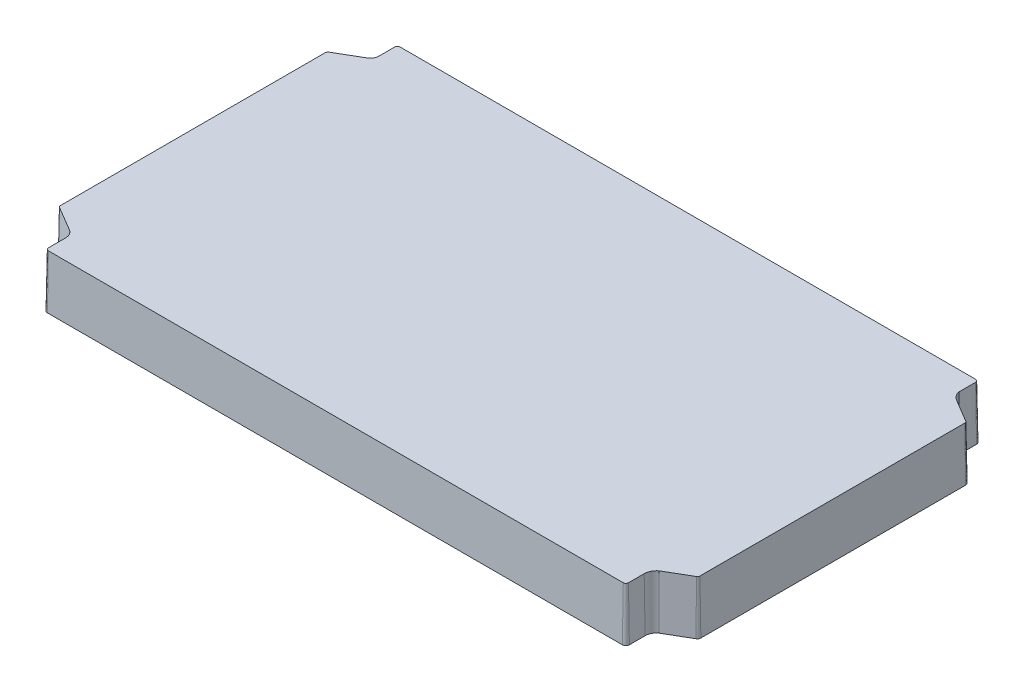
ISO-10303-21;
HEADER;
FILE_DESCRIPTION(('STEP AP214'),'2;1');
FILE_NAME('part.step','',(''),(''),'','','');
FILE_SCHEMA(('AUTOMOTIVE_DESIGN { 1 0 10303 214 1 1 1 1 }'));
ENDSEC;
DATA;
#1=APPLICATION_CONTEXT('core data for automotive mechanical design processes');
#2=APPLICATION_PROTOCOL_DEFINITION('international standard','automotive_design',2000,#1);
#3=PRODUCT_CONTEXT('',#1,'mechanical');
#4=PRODUCT('Part','Part','',(#3));
#5=PRODUCT_RELATED_PRODUCT_CATEGORY('part','',(#4));
#6=PRODUCT_DEFINITION_FORMATION('','',#4);
#7=PRODUCT_DEFINITION_CONTEXT('part definition',#1,'design');
#8=PRODUCT_DEFINITION('design','',#6,#7);
#9=PRODUCT_DEFINITION_SHAPE('','',#8);
#10=(LENGTH_UNIT() NAMED_UNIT(*) SI_UNIT(.MILLI.,.METRE.));
#11=(NAMED_UNIT(*) PLANE_ANGLE_UNIT() SI_UNIT($,.RADIAN.));
#12=(NAMED_UNIT(*) SI_UNIT($,.STERADIAN.) SOLID_ANGLE_UNIT());
#13=UNCERTAINTY_MEASURE_WITH_UNIT(LENGTH_MEASURE(1.E-05),#10,'distance_accuracy_value','');
#14=(GEOMETRIC_REPRESENTATION_CONTEXT(3) GLOBAL_UNCERTAINTY_ASSIGNED_CONTEXT((#13)) GLOBAL_UNIT_ASSIGNED_CONTEXT((#10,
#11,#12)) REPRESENTATION_CONTEXT('',''));
#15=CARTESIAN_POINT('',(0.,0.,0.));
#16=DIRECTION('',(0.,0.,1.));
#17=DIRECTION('',(1.,0.,0.));
#18=AXIS2_PLACEMENT_3D('',#15,#16,#17);
#19=CARTESIAN_POINT('',(1.27525855985953,-37.5520685347959,-53.5938253126815));
#20=DIRECTION('',(0.,1.,0.));
#21=DIRECTION('',(0.,0.,1.));
#22=AXIS2_PLACEMENT_3D('',#19,#20,#21);
#23=PLANE('',#22);
#24=CARTESIAN_POINT('',(150.000002264977,-37.5520685348079,-115.811683449461));
#25=DIRECTION('',(0.,-1.,0.));
#26=DIRECTION('',(0.,0.,-1.));
#27=AXIS2_PLACEMENT_3D('',#24,#25,#26);
#28=CIRCLE('',#27,1.21452207822959);
#29=CARTESIAN_POINT('',(150.621817367156,-37.5520685348019,-116.854952282126));
#30=VERTEX_POINT('',#29);
#31=CARTESIAN_POINT('',(151.214524343206,-37.5520685348049,-115.811683449461));
#32=VERTEX_POINT('',#31);
#33=EDGE_CURVE('E370',#30,#32,#28,.T.);
#34=ORIENTED_EDGE('',*,*,#33,.F.);
#35=DIRECTION('',(-0.858995362344732,0.,-0.511983366399968));
#36=VECTOR('',#35,1.);
#37=CARTESIAN_POINT('',(150.621817367156,-37.5520685347959,-116.854952282126));
#38=LINE('',#37,#36);
#39=CARTESIAN_POINT('',(139.946159268952,-37.5520685348191,-123.217919547437));
#40=VERTEX_POINT('',#39);
#41=EDGE_CURVE('E228',#40,#30,#38,.F.);
#42=ORIENTED_EDGE('',*,*,#41,.F.);
#43=CARTESIAN_POINT('',(142.993689676321,-37.5520685348079,-128.331004577799));
#44=DIRECTION('',(0.,1.,0.));
#45=DIRECTION('',(0.,0.,1.));
#46=AXIS2_PLACEMENT_3D('',#43,#44,#45);
#47=CIRCLE('',#46,5.9524012055257);
#48=CARTESIAN_POINT('',(137.188246659893,-37.5520685348019,-127.016504104446));
#49=VERTEX_POINT('',#48);
#50=EDGE_CURVE('E227',#40,#49,#47,.F.);
#51=ORIENTED_EDGE('',*,*,#50,.T.);
#52=DIRECTION('',(0.,0.,1.));
#53=VECTOR('',#52,1.);
#54=CARTESIAN_POINT('',(137.188246659893,-37.5520685347959,-127.10746599294));
#55=LINE('',#54,#53);
#56=CARTESIAN_POINT('',(137.188246659892,-37.5520685347764,-134.931371769247));
#57=VERTEX_POINT('',#56);
#58=EDGE_CURVE('E224',#57,#49,#55,.T.);
#59=ORIENTED_EDGE('',*,*,#58,.F.);
#60=CARTESIAN_POINT('',(135.973724581662,-37.5520685348079,-134.931371769247));
#61=DIRECTION('',(0.,-1.,0.));
#62=DIRECTION('',(0.,0.,-1.));
#63=AXIS2_PLACEMENT_3D('',#60,#61,#62);
#64=CIRCLE('',#63,1.21452207823082);
#65=CARTESIAN_POINT('',(135.973724581662,-37.5520685348019,-136.145893847478));
#66=VERTEX_POINT('',#65);
#67=EDGE_CURVE('E364',#66,#57,#64,.T.);
#68=ORIENTED_EDGE('',*,*,#67,.F.);
#69=DIRECTION('',(1.,0.,0.));
#70=VECTOR('',#69,1.);
#71=CARTESIAN_POINT('',(135.973724581662,-37.5520685347959,-136.145893847478));
#72=LINE('',#71,#70);
#73=CARTESIAN_POINT('',(-134.006635424686,-37.5520685347764,-136.145893847477));
#74=VERTEX_POINT('',#73);
#75=EDGE_CURVE('E220',#74,#66,#72,.T.);
#76=ORIENTED_EDGE('',*,*,#75,.F.);
#77=CARTESIAN_POINT('',(-134.006635424686,-37.5520685348079,-134.931371769247));
#78=DIRECTION('',(0.,-1.,0.));
#79=DIRECTION('',(0.,0.,-1.));
#80=AXIS2_PLACEMENT_3D('',#77,#78,#79);
#81=CIRCLE('',#80,1.2145220782301);
#82=CARTESIAN_POINT('',(-135.221157502917,-37.5520685348019,-134.931371769247));
#83=VERTEX_POINT('',#82);
#84=EDGE_CURVE('E361',#83,#74,#81,.T.);
#85=ORIENTED_EDGE('',*,*,#84,.F.);
#86=DIRECTION('',(0.,0.,1.));
#87=VECTOR('',#86,1.);
#88=CARTESIAN_POINT('',(-135.221157502917,-37.5520685347959,-134.931371769247));
#89=LINE('',#88,#87);
#90=CARTESIAN_POINT('',(-135.221157502917,-37.5520685348191,-127.447933357651));
#91=VERTEX_POINT('',#90);
#92=EDGE_CURVE('E216',#91,#83,#89,.F.);
#93=ORIENTED_EDGE('',*,*,#92,.F.);
#94=CARTESIAN_POINT('',(-139.260806180419,-37.5520685348079,-127.447933357651));
#95=DIRECTION('',(0.,1.,0.));
#96=DIRECTION('',(0.,0.,1.));
#97=AXIS2_PLACEMENT_3D('',#94,#95,#96);
#98=CIRCLE('',#97,4.0396486775025);
#99=CARTESIAN_POINT('',(-137.646062276049,-37.5520685348019,-123.745047515368));
#100=VERTEX_POINT('',#99);
#101=EDGE_CURVE('E215',#91,#100,#98,.F.);
#102=ORIENTED_EDGE('',*,*,#101,.T.);
#103=DIRECTION('',(-0.863778900898433,0.,0.503871025524086));
#104=VECTOR('',#103,1.);
#105=CARTESIAN_POINT('',(-137.604222490392,-37.5520685347959,-123.769454057001));
#106=LINE('',#105,#104);
#107=CARTESIAN_POINT('',(-148.611964720253,-37.5520685348049,-117.348271089582));
#108=VERTEX_POINT('',#107);
#109=EDGE_CURVE('E212',#108,#100,#106,.F.);
#110=ORIENTED_EDGE('',*,*,#109,.F.);
#111=CARTESIAN_POINT('',(-148.000002235174,-37.5520685348079,-116.299192543732));
#112=DIRECTION('',(0.,-1.,0.));
#113=DIRECTION('',(0.,0.,-1.));
#114=AXIS2_PLACEMENT_3D('',#111,#112,#113);
#115=CIRCLE('',#114,1.21452207822986);
#116=CARTESIAN_POINT('',(-149.214524313404,-37.5520685348019,-116.299192543732));
#117=VERTEX_POINT('',#116);
#118=EDGE_CURVE('E355',#117,#108,#115,.T.);
#119=ORIENTED_EDGE('',*,*,#118,.F.);
#120=DIRECTION('',(0.,0.,1.));
#121=VECTOR('',#120,1.);
#122=CARTESIAN_POINT('',(-149.214524313404,-37.5520685347959,-116.299192543731));
#123=LINE('',#122,#121);
#124=CARTESIAN_POINT('',(-149.214524313404,-37.5520685347764,7.91001186309078));
#125=VERTEX_POINT('',#124);
#126=EDGE_CURVE('E208',#125,#117,#123,.F.);
#127=ORIENTED_EDGE('',*,*,#126,.F.);
#128=CARTESIAN_POINT('',(-148.000002235174,-37.5520685348079,7.91001186309082));
#129=DIRECTION('',(0.,-1.,0.));
#130=DIRECTION('',(0.,0.,-1.));
#131=AXIS2_PLACEMENT_3D('',#128,#129,#130);
#132=CIRCLE('',#131,1.21452207823018);
#133=CARTESIAN_POINT('',(-148.617237042366,-37.5520685348019,8.95599707871289));
#134=VERTEX_POINT('',#133);
#135=EDGE_CURVE('E294',#134,#125,#132,.T.);
#136=ORIENTED_EDGE('',*,*,#135,.F.);
#137=DIRECTION('',(0.861231948245889,0.,0.508212092851587));
#138=VECTOR('',#137,1.);
#139=CARTESIAN_POINT('',(-148.617237042366,-37.5520685347959,8.95599707871262));
#140=LINE('',#139,#138);
#141=CARTESIAN_POINT('',(-137.311850951823,-37.5520685348191,15.6272938615034));
#142=VERTEX_POINT('',#141);
#143=EDGE_CURVE('E204',#142,#134,#140,.F.);
#144=ORIENTED_EDGE('',*,*,#143,.F.);
#145=CARTESIAN_POINT('',(-139.844514483279,-37.5520685348079,19.9192239004147));
#146=DIRECTION('',(0.,1.,0.));
#147=DIRECTION('',(0.,0.,1.));
#148=AXIS2_PLACEMENT_3D('',#145,#146,#147);
#149=CIRCLE('',#148,4.98347750295871);
#150=CARTESIAN_POINT('',(-134.866001338351,-37.5520685347995,20.1416084506089));
#151=VERTEX_POINT('',#150);
#152=EDGE_CURVE('E191',#142,#151,#149,.F.);
#153=ORIENTED_EDGE('',*,*,#152,.T.);
#154=DIRECTION('',(0.,0.,1.));
#155=VECTOR('',#154,1.);
#156=CARTESIAN_POINT('',(-134.866001338351,-37.5520685347959,20.1233221634976));
#157=LINE('',#156,#155);
#158=CARTESIAN_POINT('',(-134.86600133835,-37.5520685347764,27.926674135369));
#159=VERTEX_POINT('',#158);
#160=EDGE_CURVE('E188',#159,#151,#157,.F.);
#161=ORIENTED_EDGE('',*,*,#160,.F.);
#162=CARTESIAN_POINT('',(-133.651479260121,-37.5520685348079,27.926674135369));
#163=DIRECTION('',(0.,-1.,0.));
#164=DIRECTION('',(0.,0.,-1.));
#165=AXIS2_PLACEMENT_3D('',#162,#163,#164);
#166=CIRCLE('',#165,1.21452207822968);
#167=CARTESIAN_POINT('',(-133.651479260121,-37.5520685348019,29.1411962135993));
#168=VERTEX_POINT('',#167);
#169=EDGE_CURVE('E20',#168,#159,#166,.T.);
#170=ORIENTED_EDGE('',*,*,#169,.F.);
#171=DIRECTION('',(1.,0.,0.));
#172=VECTOR('',#171,1.);
#173=CARTESIAN_POINT('',(-133.651479260121,-37.5520685347959,29.1411962135992));
#174=LINE('',#173,#172);
#175=CARTESIAN_POINT('',(136.00000205636,-37.5520685347764,29.1411962135989));
#176=VERTEX_POINT('',#175);
#177=EDGE_CURVE('E175',#176,#168,#174,.F.);
#178=ORIENTED_EDGE('',*,*,#177,.F.);
#179=CARTESIAN_POINT('',(136.00000205636,-37.5520685348079,27.926674135369));
#180=DIRECTION('',(0.,-1.,0.));
#181=DIRECTION('',(0.,0.,-1.));
#182=AXIS2_PLACEMENT_3D('',#179,#180,#181);
#183=CIRCLE('',#182,1.21452207823044);
#184=CARTESIAN_POINT('',(137.214524134591,-37.5520685348019,27.926674135369));
#185=VERTEX_POINT('',#184);
#186=EDGE_CURVE('E335',#185,#176,#183,.T.);
#187=ORIENTED_EDGE('',*,*,#186,.F.);
#188=DIRECTION('',(0.,0.,1.));
#189=VECTOR('',#188,1.);
#190=CARTESIAN_POINT('',(137.214524134591,-37.5520685347959,27.926674135369));
#191=LINE('',#190,#189);
#192=CARTESIAN_POINT('',(137.214524134592,-37.5520685348475,20.5520688477202));
#193=VERTEX_POINT('',#192);
#194=EDGE_CURVE('E240',#193,#185,#191,.T.);
#195=ORIENTED_EDGE('',*,*,#194,.F.);
#196=CARTESIAN_POINT('',(143.000002130866,-37.5520685348079,20.5520688477204));
#197=DIRECTION('',(0.,1.,0.));
#198=DIRECTION('',(0.,0.,1.));
#199=AXIS2_PLACEMENT_3D('',#196,#197,#198);
#200=CIRCLE('',#199,5.78547799627524);
#201=CARTESIAN_POINT('',(139.566455468486,-37.5520685348019,15.8956203123322));
#202=VERTEX_POINT('',#201);
#203=EDGE_CURVE('E239',#193,#202,#200,.F.);
#204=ORIENTED_EDGE('',*,*,#203,.T.);
#205=DIRECTION('',(0.863778900898433,0.,-0.503871025524087));
#206=VECTOR('',#205,1.);
#207=CARTESIAN_POINT('',(139.604222520194,-37.5520685347959,15.8735895321695));
#208=LINE('',#207,#206);
#209=CARTESIAN_POINT('',(150.611964750056,-37.5520685347764,9.45240656474914));
#210=VERTEX_POINT('',#209);
#211=EDGE_CURVE('E236',#210,#202,#208,.F.);
#212=ORIENTED_EDGE('',*,*,#211,.F.);
#213=CARTESIAN_POINT('',(150.000002264977,-37.5520685348079,8.40332801889941));
#214=DIRECTION('',(0.,-1.,0.));
#215=DIRECTION('',(0.,0.,-1.));
#216=AXIS2_PLACEMENT_3D('',#213,#214,#215);
#217=CIRCLE('',#216,1.21452207822921);
#218=CARTESIAN_POINT('',(151.214524343207,-37.5520685348019,8.40332801889936));
#219=VERTEX_POINT('',#218);
#220=EDGE_CURVE('E331',#219,#210,#217,.T.);
#221=ORIENTED_EDGE('',*,*,#220,.F.);
#222=DIRECTION('',(0.,0.,1.));
#223=VECTOR('',#222,1.);
#224=CARTESIAN_POINT('',(151.214524343207,-37.5520685347959,8.40332801889936));
#225=LINE('',#224,#223);
#226=EDGE_CURVE('E232',#32,#219,#225,.T.);
#227=ORIENTED_EDGE('',*,*,#226,.F.);
#228=EDGE_LOOP('',(#34,#42,#51,#59,#68,#76,#85,#93,#102,#110,#119,#127,#136,#144,#153,#161,#170,
#178,#187,#195,#204,#212,#221,#227));
#229=FACE_BOUND('',#228,.T.);
#230=ADVANCED_FACE('F17',(#229),#23,.T.);
#231=CARTESIAN_POINT('',(-135.302431131375,-62.5551146316681,20.1233221634976));
#232=DIRECTION('',(-0.999847695156391,0.0174524064372835,0.));
#233=DIRECTION('',(-0.0174524064372835,-0.999847695156391,0.));
#234=AXIS2_PLACEMENT_3D('',#231,#232,#233);
#235=PLANE('',#234);
#236=DIRECTION('',(0.,0.,1.));
#237=VECTOR('',#236,1.);
#238=CARTESIAN_POINT('',(-135.302377961556,-62.5520685347959,-53.5938253126815));
#239=LINE('',#238,#237);
#240=CARTESIAN_POINT('',(-135.302377961556,-62.5520685347926,20.1316438349495));
#241=VERTEX_POINT('',#240);
#242=CARTESIAN_POINT('',(-135.302377961556,-62.5520685347736,27.926674135369));
#243=VERTEX_POINT('',#242);
#244=EDGE_CURVE('E198',#241,#243,#239,.T.);
#245=ORIENTED_EDGE('',*,*,#244,.T.);
#246=DIRECTION('',(0.0174524064372836,0.999847695156391,0.));
#247=VECTOR('',#246,1.);
#248=CARTESIAN_POINT('',(-8844.28792672451,-499000.,27.9266741353237));
#249=LINE('',#248,#247);
#250=EDGE_CURVE('E184',#159,#243,#249,.F.);
#251=ORIENTED_EDGE('',*,*,#250,.F.);
#252=ORIENTED_EDGE('',*,*,#160,.T.);
#253=CARTESIAN_POINT('',(-134.866001338353,-37.552068534803,20.1416084508572));
#254=CARTESIAN_POINT('',(-134.922989208389,-40.8169014226254,20.1403368105586));
#255=CARTESIAN_POINT('',(-134.979977078344,-44.0817343058272,20.1390535454069));
#256=CARTESIAN_POINT('',(-135.125435952859,-52.4150676456717,20.1357483991865));
#257=CARTESIAN_POINT('',(-135.213906957304,-57.4835680957987,20.1337101257829));
#258=CARTESIAN_POINT('',(-135.302377961556,-62.5520685347894,20.1316438351912));
#259=B_SPLINE_CURVE_WITH_KNOTS('',3,(#253,#254,#255,#256,#257,#258),.UNSPECIFIED.,.F.,.F.,(4,2,
4),(0.,9.7959913829048,25.0038101868988),.UNSPECIFIED.);
#260=EDGE_CURVE('E287',#151,#241,#259,.T.);
#261=ORIENTED_EDGE('',*,*,#260,.T.);
#262=EDGE_LOOP('',(#245,#251,#252,#261));
#263=FACE_BOUND('',#262,.T.);
#264=ADVANCED_FACE('F197',(#263),#235,.T.);
#265=CARTESIAN_POINT('',(-133.651479260121,-62.5520685346146,27.926674135369));
#266=DIRECTION('',(0.,-1.,0.));
#267=DIRECTION('',(0.,0.,-1.));
#268=AXIS2_PLACEMENT_3D('',#265,#266,#267);
#269=CONICAL_SURFACE('',#268,1.65089870143376,0.0174532925200236);
#270=CARTESIAN_POINT('',(-133.651479260121,-62.5520685347851,27.926674135369));
#271=DIRECTION('',(0.,-1.,0.));
#272=DIRECTION('',(0.,0.,-1.));
#273=AXIS2_PLACEMENT_3D('',#270,#271,#272);
#274=CIRCLE('',#273,1.65089870143673);
#275=CARTESIAN_POINT('',(-133.651479260121,-62.5520685347905,29.5775728368045));
#276=VERTEX_POINT('',#275);
#277=EDGE_CURVE('E284',#243,#276,#274,.F.);
#278=ORIENTED_EDGE('',*,*,#277,.T.);
#279=DIRECTION('',(0.,-0.999847695156391,0.0174524064372835));
#280=VECTOR('',#279,1.);
#281=CARTESIAN_POINT('',(-133.651479260121,-62.5551146316681,29.5776260066233));
#282=LINE('',#281,#280);
#283=EDGE_CURVE('E186',#168,#276,#282,.T.);
#284=ORIENTED_EDGE('',*,*,#283,.F.);
#285=ORIENTED_EDGE('',*,*,#169,.T.);
#286=ORIENTED_EDGE('',*,*,#250,.T.);
#287=EDGE_LOOP('',(#278,#284,#285,#286));
#288=FACE_BOUND('',#287,.T.);
#289=ADVANCED_FACE('F182',(#288),#269,.T.);
#290=CARTESIAN_POINT('',(-133.651479260121,-62.5551146316681,29.5776260066233));
#291=DIRECTION('',(0.,0.0174524064372835,0.999847695156391));
#292=DIRECTION('',(0.,-0.999847695156391,0.0174524064372835));
#293=AXIS2_PLACEMENT_3D('',#290,#291,#292);
#294=PLANE('',#293);
#295=DIRECTION('',(1.,0.,0.));
#296=VECTOR('',#295,1.);
#297=CARTESIAN_POINT('',(1.27525855985953,-62.5520685347959,29.5775728368047));
#298=LINE('',#297,#296);
#299=CARTESIAN_POINT('',(136.00000205636,-62.5520685347736,29.5775728368048));
#300=VERTEX_POINT('',#299);
#301=EDGE_CURVE('E283',#276,#300,#298,.T.);
#302=ORIENTED_EDGE('',*,*,#301,.T.);
#303=DIRECTION('',(0.,0.999847695156391,-0.0174524064372835));
#304=VECTOR('',#303,1.);
#305=CARTESIAN_POINT('',(136.000002056239,-499000.,8738.56312159972));
#306=LINE('',#305,#304);
#307=EDGE_CURVE('E242',#176,#300,#306,.F.);
#308=ORIENTED_EDGE('',*,*,#307,.F.);
#309=ORIENTED_EDGE('',*,*,#177,.T.);
#310=ORIENTED_EDGE('',*,*,#283,.T.);
#311=EDGE_LOOP('',(#302,#308,#309,#310));
#312=FACE_BOUND('',#311,.T.);
#313=ADVANCED_FACE('F305',(#312),#294,.T.);
#314=CARTESIAN_POINT('',(136.00000205636,-62.5520685346146,27.926674135369));
#315=DIRECTION('',(0.,-1.,0.));
#316=DIRECTION('',(0.,0.,-1.));
#317=AXIS2_PLACEMENT_3D('',#314,#315,#316);
#318=CONICAL_SURFACE('',#317,1.65089870143273,0.0174532925199526);
#319=CARTESIAN_POINT('',(136.00000205636,-62.5520685347851,27.926674135369));
#320=DIRECTION('',(0.,-1.,0.));
#321=DIRECTION('',(0.,0.,-1.));
#322=AXIS2_PLACEMENT_3D('',#319,#320,#321);
#323=CIRCLE('',#322,1.65089870143571);
#324=CARTESIAN_POINT('',(137.650900757796,-62.5520685347905,27.926674135369));
#325=VERTEX_POINT('',#324);
#326=EDGE_CURVE('E280',#300,#325,#323,.F.);
#327=ORIENTED_EDGE('',*,*,#326,.T.);
#328=DIRECTION('',(-0.0174524064372835,0.999847695156391,0.));
#329=VECTOR('',#328,1.);
#330=CARTESIAN_POINT('',(137.650953927615,-62.5551146316681,27.926674135369));
#331=LINE('',#330,#329);
#332=EDGE_CURVE('E241',#185,#325,#331,.F.);
#333=ORIENTED_EDGE('',*,*,#332,.F.);
#334=ORIENTED_EDGE('',*,*,#186,.T.);
#335=ORIENTED_EDGE('',*,*,#307,.T.);
#336=EDGE_LOOP('',(#327,#333,#334,#335));
#337=FACE_BOUND('',#336,.T.);
#338=ADVANCED_FACE('F308',(#337),#318,.T.);
#339=CARTESIAN_POINT('',(137.650953927615,-62.5551146316681,27.926674135369));
#340=DIRECTION('',(0.999847695156391,0.0174524064372835,0.));
#341=DIRECTION('',(-0.0174524064372835,0.999847695156391,0.));
#342=AXIS2_PLACEMENT_3D('',#339,#340,#341);
#343=PLANE('',#342);
#344=DIRECTION('',(0.,0.,1.));
#345=VECTOR('',#344,1.);
#346=CARTESIAN_POINT('',(137.650900757796,-62.5520685347959,-53.5938253126815));
#347=LINE('',#346,#345);
#348=CARTESIAN_POINT('',(137.650900757796,-62.5520685347878,20.5520688477202));
#349=VERTEX_POINT('',#348);
#350=EDGE_CURVE('E279',#325,#349,#347,.F.);
#351=ORIENTED_EDGE('',*,*,#350,.T.);
#352=DIRECTION('',(0.0174524064372835,-0.999847695156391,0.));
#353=VECTOR('',#352,1.);
#354=CARTESIAN_POINT('',(-8573.51834884045,499000.,20.5520688478845));
#355=LINE('',#354,#353);
#356=EDGE_CURVE('E334',#349,#193,#355,.F.);
#357=ORIENTED_EDGE('',*,*,#356,.T.);
#358=ORIENTED_EDGE('',*,*,#194,.T.);
#359=ORIENTED_EDGE('',*,*,#332,.T.);
#360=EDGE_LOOP('',(#351,#357,#358,#359));
#361=FACE_BOUND('',#360,.T.);
#362=ADVANCED_FACE('F311',(#361),#343,.T.);
#363=CARTESIAN_POINT('',(143.000002130866,-37.5520685349215,20.5520688477204));
#364=DIRECTION('',(0.,1.,0.));
#365=DIRECTION('',(0.,0.,1.));
#366=AXIS2_PLACEMENT_3D('',#363,#364,#365);
#367=CONICAL_SURFACE('',#366,5.78547799627326,0.0174532925199484);
#368=ORIENTED_EDGE('',*,*,#356,.F.);
#369=CARTESIAN_POINT('',(143.000002130866,-62.5520685347851,20.5520688477204));
#370=DIRECTION('',(0.,1.,0.));
#371=DIRECTION('',(0.,0.,1.));
#372=AXIS2_PLACEMENT_3D('',#369,#370,#371);
#373=CIRCLE('',#372,5.34910137307007);
#374=CARTESIAN_POINT('',(139.806972351597,-62.5520685347894,16.2605136135333));
#375=VERTEX_POINT('',#374);
#376=EDGE_CURVE('E276',#349,#375,#373,.F.);
#377=ORIENTED_EDGE('',*,*,#376,.T.);
#378=CARTESIAN_POINT('',(139.566455468536,-37.5520685347982,15.8956203123033));
#379=CARTESIAN_POINT('',(139.602858797246,-41.3423158004728,15.9509775680741));
#380=CARTESIAN_POINT('',(139.639290056579,-45.1325630352787,16.0063185303583));
#381=CARTESIAN_POINT('',(139.719450153558,-53.4658963820909,16.1279567461757));
#382=CARTESIAN_POINT('',(139.76319118858,-58.0089824806168,16.1942468843013));
#383=CARTESIAN_POINT('',(139.806972351598,-62.5520685347937,16.2605136135328));
#384=B_SPLINE_CURVE_WITH_KNOTS('',3,(#378,#379,#380,#381,#382,#383),.UNSPECIFIED.,.F.,.F.,(4,2,
4),(0.,11.3724788695099,25.0038196191425),.UNSPECIFIED.);
#385=EDGE_CURVE('E238',#202,#375,#384,.T.);
#386=ORIENTED_EDGE('',*,*,#385,.F.);
#387=ORIENTED_EDGE('',*,*,#203,.F.);
#388=EDGE_LOOP('',(#368,#377,#386,#387));
#389=FACE_BOUND('',#388,.T.);
#390=ADVANCED_FACE('F315',(#389),#367,.F.);
#391=CARTESIAN_POINT('',(139.824126847574,-62.5551146316681,16.2505683791072));
#392=DIRECTION('',(0.503794283526345,0.0174524064372835,0.863647343188019));
#393=DIRECTION('',(0.863778900898433,0.,-0.503871025524087));
#394=AXIS2_PLACEMENT_3D('',#391,#392,#393);
#395=PLANE('',#394);
#396=DIRECTION('',(0.863778900898432,0.,-0.503871025524089));
#397=VECTOR('',#396,1.);
#398=CARTESIAN_POINT('',(139.806972351499,-62.5520685347959,16.2605136135903));
#399=LINE('',#398,#397);
#400=CARTESIAN_POINT('',(150.831842286705,-62.5520685347736,9.82933948471974));
#401=VERTEX_POINT('',#400);
#402=EDGE_CURVE('E275',#375,#401,#399,.T.);
#403=ORIENTED_EDGE('',*,*,#402,.T.);
#404=DIRECTION('',(-0.00879376192941683,0.999847695156391,-0.0150750204504297));
#405=VECTOR('',#404,1.);
#406=CARTESIAN_POINT('',(4539.03732201613,-499000.,7532.46730473559));
#407=LINE('',#406,#405);
#408=EDGE_CURVE('E235',#210,#401,#407,.F.);
#409=ORIENTED_EDGE('',*,*,#408,.F.);
#410=ORIENTED_EDGE('',*,*,#211,.T.);
#411=ORIENTED_EDGE('',*,*,#385,.T.);
#412=EDGE_LOOP('',(#403,#409,#410,#411));
#413=FACE_BOUND('',#412,.T.);
#414=ADVANCED_FACE('F320',(#413),#395,.T.);
#415=CARTESIAN_POINT('',(150.000002264977,-62.5520685346146,8.40332801889941));
#416=DIRECTION('',(0.,-1.,0.));
#417=DIRECTION('',(0.,0.,-1.));
#418=AXIS2_PLACEMENT_3D('',#415,#416,#417);
#419=CONICAL_SURFACE('',#418,1.65089870143233,0.0174532925199854);
#420=CARTESIAN_POINT('',(150.000002264977,-62.5520685347851,8.40332801889941));
#421=DIRECTION('',(0.,-1.,0.));
#422=DIRECTION('',(0.,0.,-1.));
#423=AXIS2_PLACEMENT_3D('',#420,#421,#422);
#424=CIRCLE('',#423,1.65089870143531);
#425=CARTESIAN_POINT('',(151.650900966412,-62.5520685347905,8.40332801889939));
#426=VERTEX_POINT('',#425);
#427=EDGE_CURVE('E272',#401,#426,#424,.F.);
#428=ORIENTED_EDGE('',*,*,#427,.T.);
#429=DIRECTION('',(-0.0174524064372835,0.999847695156391,0.));
#430=VECTOR('',#429,1.);
#431=CARTESIAN_POINT('',(151.650954136231,-62.5551146316681,8.40332801889936));
#432=LINE('',#431,#430);
#433=EDGE_CURVE('E234',#219,#426,#432,.F.);
#434=ORIENTED_EDGE('',*,*,#433,.F.);
#435=ORIENTED_EDGE('',*,*,#220,.T.);
#436=ORIENTED_EDGE('',*,*,#408,.T.);
#437=EDGE_LOOP('',(#428,#434,#435,#436));
#438=FACE_BOUND('',#437,.T.);
#439=ADVANCED_FACE('F389',(#438),#419,.T.);
#440=CARTESIAN_POINT('',(151.650954136231,-62.5551146316681,8.40332801889936));
#441=DIRECTION('',(0.999847695156391,0.0174524064372835,0.));
#442=DIRECTION('',(-0.0174524064372835,0.999847695156391,0.));
#443=AXIS2_PLACEMENT_3D('',#440,#441,#442);
#444=PLANE('',#443);
#445=DIRECTION('',(0.,0.,1.));
#446=VECTOR('',#445,1.);
#447=CARTESIAN_POINT('',(151.650900966412,-62.5520685347959,-53.5938253126815));
#448=LINE('',#447,#446);
#449=CARTESIAN_POINT('',(151.650900966411,-62.5520685347736,-115.811683449461));
#450=VERTEX_POINT('',#449);
#451=EDGE_CURVE('E271',#426,#450,#448,.F.);
#452=ORIENTED_EDGE('',*,*,#451,.T.);
#453=DIRECTION('',(-0.0174524064372834,0.999847695156391,0.));
#454=VECTOR('',#453,1.);
#455=CARTESIAN_POINT('',(8860.63644972926,-499000.,-115.81168344928));
#456=LINE('',#455,#454);
#457=EDGE_CURVE('E231',#32,#450,#456,.F.);
#458=ORIENTED_EDGE('',*,*,#457,.F.);
#459=ORIENTED_EDGE('',*,*,#226,.T.);
#460=ORIENTED_EDGE('',*,*,#433,.T.);
#461=EDGE_LOOP('',(#452,#458,#459,#460));
#462=FACE_BOUND('',#461,.T.);
#463=ADVANCED_FACE('F473',(#462),#444,.T.);
#464=CARTESIAN_POINT('',(150.000002264977,-62.5520685347283,-115.811683449461));
#465=DIRECTION('',(0.,-1.,0.));
#466=DIRECTION('',(0.,0.,-1.));
#467=AXIS2_PLACEMENT_3D('',#464,#465,#466);
#468=CONICAL_SURFACE('',#467,1.65089870143387,0.0174532925199526);
#469=CARTESIAN_POINT('',(150.000002264977,-62.5520685347851,-115.811683449461));
#470=DIRECTION('',(0.,-1.,0.));
#471=DIRECTION('',(0.,0.,-1.));
#472=AXIS2_PLACEMENT_3D('',#469,#470,#471);
#473=CIRCLE('',#472,1.65089870143486);
#474=CARTESIAN_POINT('',(150.845234939723,-62.5520685347905,-117.229797777695));
#475=VERTEX_POINT('',#474);
#476=EDGE_CURVE('E268',#450,#475,#473,.F.);
#477=ORIENTED_EDGE('',*,*,#476,.T.);
#478=DIRECTION('',(-0.00893534179954088,0.999847695156391,0.0149915361913819));
#479=VECTOR('',#478,1.);
#480=CARTESIAN_POINT('',(150.845262161786,-62.5551146316681,-117.229843450323));
#481=LINE('',#480,#479);
#482=EDGE_CURVE('E230',#30,#475,#481,.F.);
#483=ORIENTED_EDGE('',*,*,#482,.F.);
#484=ORIENTED_EDGE('',*,*,#33,.T.);
#485=ORIENTED_EDGE('',*,*,#457,.T.);
#486=EDGE_LOOP('',(#477,#483,#484,#485));
#487=FACE_BOUND('',#486,.T.);
#488=ADVANCED_FACE('F472',(#487),#468,.T.);
#489=CARTESIAN_POINT('',(150.845262161786,-62.5551146316681,-117.229843450323));
#490=DIRECTION('',(0.511905388853418,0.0174524064372835,-0.858864533190409));
#491=DIRECTION('',(-0.858995362344732,0.,-0.511983366399968));
#492=AXIS2_PLACEMENT_3D('',#489,#490,#491);
#493=PLANE('',#492);
#494=DIRECTION('',(-0.858995362344735,0.,-0.511983366399961));
#495=VECTOR('',#494,1.);
#496=CARTESIAN_POINT('',(150.845234939723,-62.5520685347959,-117.229797777695));
#497=LINE('',#496,#495);
#498=CARTESIAN_POINT('',(140.169576841519,-62.5520685347878,-123.592765043006));
#499=VERTEX_POINT('',#498);
#500=EDGE_CURVE('E267',#475,#499,#497,.T.);
#501=ORIENTED_EDGE('',*,*,#500,.T.);
#502=DIRECTION('',(0.00893534179954231,-0.999847695156391,-0.0149915361913811));
#503=VECTOR('',#502,1.);
#504=CARTESIAN_POINT('',(-4319.80418084839,499000.,7359.26122096151));
#505=LINE('',#504,#503);
#506=EDGE_CURVE('E365',#499,#40,#505,.F.);
#507=ORIENTED_EDGE('',*,*,#506,.T.);
#508=ORIENTED_EDGE('',*,*,#41,.T.);
#509=ORIENTED_EDGE('',*,*,#482,.T.);
#510=EDGE_LOOP('',(#501,#507,#508,#509));
#511=FACE_BOUND('',#510,.T.);
#512=ADVANCED_FACE('F469',(#511),#493,.T.);
#513=CARTESIAN_POINT('',(142.993689676321,-37.5520685348079,-128.331004577799));
#514=DIRECTION('',(0.,1.,0.));
#515=DIRECTION('',(0.,0.,1.));
#516=AXIS2_PLACEMENT_3D('',#513,#514,#515);
#517=CONICAL_SURFACE('',#516,5.9524012055257,0.0174532925198938);
#518=ORIENTED_EDGE('',*,*,#506,.F.);
#519=CARTESIAN_POINT('',(142.993689676321,-62.5520685347851,-128.331004577799));
#520=DIRECTION('',(0.,1.,0.));
#521=DIRECTION('',(0.,0.,1.));
#522=AXIS2_PLACEMENT_3D('',#519,#520,#521);
#523=CIRCLE('',#522,5.5160245823219);
#524=CARTESIAN_POINT('',(137.624623283098,-62.5520685347895,-127.066230582991));
#525=VERTEX_POINT('',#524);
#526=EDGE_CURVE('E264',#499,#525,#523,.F.);
#527=ORIENTED_EDGE('',*,*,#526,.T.);
#528=CARTESIAN_POINT('',(137.188246659895,-37.5520685347984,-127.016504104406));
#529=CARTESIAN_POINT('',(137.256314399098,-41.4516667021238,-127.024111294043));
#530=CARTESIAN_POINT('',(137.324382135878,-45.351264730573,-127.031788368138));
#531=CARTESIAN_POINT('',(137.469841010989,-53.6845981045548,-127.04834340537));
#532=CARTESIAN_POINT('',(137.54723214861,-58.1183334094374,-127.057241824137));
#533=CARTESIAN_POINT('',(137.624623283098,-62.5520685347938,-127.06623058299));
#534=B_SPLINE_CURVE_WITH_KNOTS('',3,(#528,#529,#530,#531,#532,#533),.UNSPECIFIED.,.F.,.F.,(4,2,
4),(0.,11.7005988068849,25.0038576525292),.UNSPECIFIED.);
#535=EDGE_CURVE('E226',#49,#525,#534,.T.);
#536=ORIENTED_EDGE('',*,*,#535,.F.);
#537=ORIENTED_EDGE('',*,*,#50,.F.);
#538=EDGE_LOOP('',(#518,#527,#536,#537));
#539=FACE_BOUND('',#538,.T.);
#540=ADVANCED_FACE('F466',(#539),#517,.F.);
#541=CARTESIAN_POINT('',(137.624676452917,-62.5551146316681,-127.10746599294));
#542=DIRECTION('',(0.999847695156391,0.0174524064372835,0.));
#543=DIRECTION('',(-0.0174524064372835,0.999847695156391,0.));
#544=AXIS2_PLACEMENT_3D('',#541,#542,#543);
#545=PLANE('',#544);
#546=DIRECTION('',(0.,0.,1.));
#547=VECTOR('',#546,1.);
#548=CARTESIAN_POINT('',(137.624623283098,-62.5520685347959,-53.5938253126815));
#549=LINE('',#548,#547);
#550=CARTESIAN_POINT('',(137.624623283098,-62.5520685347736,-134.931371769247));
#551=VERTEX_POINT('',#550);
#552=EDGE_CURVE('E263',#525,#551,#549,.F.);
#553=ORIENTED_EDGE('',*,*,#552,.T.);
#554=DIRECTION('',(-0.0174524064372836,0.999847695156391,0.));
#555=VECTOR('',#554,1.);
#556=CARTESIAN_POINT('',(8846.61017204606,-499000.,-134.931371769247));
#557=LINE('',#556,#555);
#558=EDGE_CURVE('E223',#57,#551,#557,.F.);
#559=ORIENTED_EDGE('',*,*,#558,.F.);
#560=ORIENTED_EDGE('',*,*,#58,.T.);
#561=ORIENTED_EDGE('',*,*,#535,.T.);
#562=EDGE_LOOP('',(#553,#559,#560,#561));
#563=FACE_BOUND('',#562,.T.);
#564=ADVANCED_FACE('F461',(#563),#545,.T.);
#565=CARTESIAN_POINT('',(135.973724581662,-62.5520685346146,-134.931371769247));
#566=DIRECTION('',(0.,-1.,0.));
#567=DIRECTION('',(0.,0.,-1.));
#568=AXIS2_PLACEMENT_3D('',#565,#566,#567);
#569=CONICAL_SURFACE('',#568,1.65089870143489,0.0174532925200236);
#570=CARTESIAN_POINT('',(135.973724581662,-62.5520685347851,-134.931371769247));
#571=DIRECTION('',(0.,-1.,0.));
#572=DIRECTION('',(0.,0.,-1.));
#573=AXIS2_PLACEMENT_3D('',#570,#571,#572);
#574=CIRCLE('',#573,1.65089870143787);
#575=CARTESIAN_POINT('',(135.973724581662,-62.5520685347905,-136.582270470683));
#576=VERTEX_POINT('',#575);
#577=EDGE_CURVE('E260',#551,#576,#574,.F.);
#578=ORIENTED_EDGE('',*,*,#577,.T.);
#579=DIRECTION('',(0.,0.999847695156391,0.0174524064372835));
#580=VECTOR('',#579,1.);
#581=CARTESIAN_POINT('',(135.973724581662,-62.5551146316681,-136.582323640502));
#582=LINE('',#581,#580);
#583=EDGE_CURVE('E222',#66,#576,#582,.F.);
#584=ORIENTED_EDGE('',*,*,#583,.F.);
#585=ORIENTED_EDGE('',*,*,#67,.T.);
#586=ORIENTED_EDGE('',*,*,#558,.T.);
#587=EDGE_LOOP('',(#578,#584,#585,#586));
#588=FACE_BOUND('',#587,.T.);
#589=ADVANCED_FACE('F457',(#588),#569,.T.);
#590=CARTESIAN_POINT('',(135.973724581662,-62.5551146316681,-136.582323640502));
#591=DIRECTION('',(0.,0.0174524064372835,-0.999847695156391));
#592=DIRECTION('',(0.,0.999847695156391,0.0174524064372835));
#593=AXIS2_PLACEMENT_3D('',#590,#591,#592);
#594=PLANE('',#593);
#595=DIRECTION('',(1.,0.,0.));
#596=VECTOR('',#595,1.);
#597=CARTESIAN_POINT('',(1.27525855985953,-62.5520685347959,-136.582270470683));
#598=LINE('',#597,#596);
#599=CARTESIAN_POINT('',(-134.006635424686,-62.5520685347736,-136.582270470683));
#600=VERTEX_POINT('',#599);
#601=EDGE_CURVE('E259',#576,#600,#598,.F.);
#602=ORIENTED_EDGE('',*,*,#601,.T.);
#603=DIRECTION('',(0.,0.999847695156391,0.0174524064372836));
#604=VECTOR('',#603,1.);
#605=CARTESIAN_POINT('',(-134.006635424686,-499000.,-8845.56781923364));
#606=LINE('',#605,#604);
#607=EDGE_CURVE('E219',#74,#600,#606,.F.);
#608=ORIENTED_EDGE('',*,*,#607,.F.);
#609=ORIENTED_EDGE('',*,*,#75,.T.);
#610=ORIENTED_EDGE('',*,*,#583,.T.);
#611=EDGE_LOOP('',(#602,#608,#609,#610));
#612=FACE_BOUND('',#611,.T.);
#613=ADVANCED_FACE('F451',(#612),#594,.T.);
#614=CARTESIAN_POINT('',(-134.006635424686,-62.5520685346146,-134.931371769247));
#615=DIRECTION('',(0.,-1.,0.));
#616=DIRECTION('',(0.,0.,-1.));
#617=AXIS2_PLACEMENT_3D('',#614,#615,#616);
#618=CONICAL_SURFACE('',#617,1.65089870143417,0.0174532925200236);
#619=CARTESIAN_POINT('',(-134.006635424686,-62.5520685347851,-134.931371769247));
#620=DIRECTION('',(0.,-1.,0.));
#621=DIRECTION('',(0.,0.,-1.));
#622=AXIS2_PLACEMENT_3D('',#619,#620,#621);
#623=CIRCLE('',#622,1.65089870143715);
#624=CARTESIAN_POINT('',(-135.657534126122,-62.5520685347905,-134.931371769247));
#625=VERTEX_POINT('',#624);
#626=EDGE_CURVE('E256',#600,#625,#623,.F.);
#627=ORIENTED_EDGE('',*,*,#626,.T.);
#628=DIRECTION('',(-0.0174524064372835,-0.999847695156391,0.));
#629=VECTOR('',#628,1.);
#630=CARTESIAN_POINT('',(-135.657587295941,-62.5551146316681,-134.931371769247));
#631=LINE('',#630,#629);
#632=EDGE_CURVE('E218',#83,#625,#631,.T.);
#633=ORIENTED_EDGE('',*,*,#632,.F.);
#634=ORIENTED_EDGE('',*,*,#84,.T.);
#635=ORIENTED_EDGE('',*,*,#607,.T.);
#636=EDGE_LOOP('',(#627,#633,#634,#635));
#637=FACE_BOUND('',#636,.T.);
#638=ADVANCED_FACE('F447',(#637),#618,.T.);
#639=CARTESIAN_POINT('',(-135.657587295941,-62.5551146316681,-134.931371769247));
#640=DIRECTION('',(-0.999847695156391,0.0174524064372835,0.));
#641=DIRECTION('',(-0.0174524064372835,-0.999847695156391,0.));
#642=AXIS2_PLACEMENT_3D('',#639,#640,#641);
#643=PLANE('',#642);
#644=DIRECTION('',(0.,0.,1.));
#645=VECTOR('',#644,1.);
#646=CARTESIAN_POINT('',(-135.657534126122,-62.5520685347959,-53.5938253126815));
#647=LINE('',#646,#645);
#648=CARTESIAN_POINT('',(-135.657534126122,-62.5520685347878,-127.447933357651));
#649=VERTEX_POINT('',#648);
#650=EDGE_CURVE('E255',#625,#649,#647,.T.);
#651=ORIENTED_EDGE('',*,*,#650,.T.);
#652=DIRECTION('',(-0.0174524064372835,-0.999847695156391,0.));
#653=VECTOR('',#652,1.);
#654=CARTESIAN_POINT('',(8575.51171547212,499000.,-127.447933357173));
#655=LINE('',#654,#653);
#656=EDGE_CURVE('E356',#649,#91,#655,.F.);
#657=ORIENTED_EDGE('',*,*,#656,.T.);
#658=ORIENTED_EDGE('',*,*,#92,.T.);
#659=ORIENTED_EDGE('',*,*,#632,.T.);
#660=EDGE_LOOP('',(#651,#657,#658,#659));
#661=FACE_BOUND('',#660,.T.);
#662=ADVANCED_FACE('F441',(#661),#643,.T.);
#663=CARTESIAN_POINT('',(-139.260806180419,-37.5520685348079,-127.447933357651));
#664=DIRECTION('',(0.,1.,0.));
#665=DIRECTION('',(0.,0.,1.));
#666=AXIS2_PLACEMENT_3D('',#663,#664,#665);
#667=CONICAL_SURFACE('',#666,4.0396486775025,0.01745329251992);
#668=ORIENTED_EDGE('',*,*,#656,.F.);
#669=CARTESIAN_POINT('',(-139.260806180419,-62.5520685347851,-127.447933357651));
#670=DIRECTION('',(0.,1.,0.));
#671=DIRECTION('',(0.,0.,1.));
#672=AXIS2_PLACEMENT_3D('',#669,#670,#671);
#673=CIRCLE('',#672,3.60327205429804);
#674=CARTESIAN_POINT('',(-137.843258484831,-62.5520685347894,-124.135211209928));
#675=VERTEX_POINT('',#674);
#676=EDGE_CURVE('E252',#649,#675,#673,.F.);
#677=ORIENTED_EDGE('',*,*,#676,.T.);
#678=CARTESIAN_POINT('',(-137.64606227602,-37.5520685347983,-123.745047515385));
#679=CARTESIAN_POINT('',(-137.667005589075,-40.1985682905642,-123.786310501093));
#680=CARTESIAN_POINT('',(-137.687927267006,-42.8450680201668,-123.827586106761));
#681=CARTESIAN_POINT('',(-137.753737599475,-51.1784014481416,-123.957595020182));
#682=CARTESIAN_POINT('',(-137.798547991148,-56.8652350518708,-124.046373979362));
#683=CARTESIAN_POINT('',(-137.843258484829,-62.5520685347937,-124.135211209929));
#684=B_SPLINE_CURVE_WITH_KNOTS('',3,(#678,#679,#680,#681,#682,#683),.UNSPECIFIED.,.F.,.F.,(4,2,
4),(0.,7.94071280800142,25.0038219913151),.UNSPECIFIED.);
#685=EDGE_CURVE('E214',#100,#675,#684,.T.);
#686=ORIENTED_EDGE('',*,*,#685,.F.);
#687=ORIENTED_EDGE('',*,*,#101,.F.);
#688=EDGE_LOOP('',(#668,#677,#686,#687));
#689=FACE_BOUND('',#688,.T.);
#690=ADVANCED_FACE('F438',(#689),#667,.F.);
#691=CARTESIAN_POINT('',(-137.824126817772,-62.5551146316681,-124.146432903939));
#692=DIRECTION('',(-0.503794283526345,0.0174524064372835,-0.86364734318802));
#693=DIRECTION('',(-0.863778900898433,0.,0.503871025524086));
#694=AXIS2_PLACEMENT_3D('',#691,#692,#693);
#695=PLANE('',#694);
#696=DIRECTION('',(-0.863778900898419,0.,0.50387102552411));
#697=VECTOR('',#696,1.);
#698=CARTESIAN_POINT('',(-137.843258484882,-62.5520685347959,-124.135211209898));
#699=LINE('',#698,#697);
#700=CARTESIAN_POINT('',(-148.831842256902,-62.5520685347594,-117.725204009553));
#701=VERTEX_POINT('',#700);
#702=EDGE_CURVE('E251',#675,#701,#699,.T.);
#703=ORIENTED_EDGE('',*,*,#702,.T.);
#704=DIRECTION('',(0.00879376192941718,0.999847695156391,0.0150750204504295));
#705=VECTOR('',#704,1.);
#706=CARTESIAN_POINT('',(-4537.0373219865,-499000.,-7640.36316926033));
#707=LINE('',#706,#705);
#708=EDGE_CURVE('E211',#108,#701,#707,.F.);
#709=ORIENTED_EDGE('',*,*,#708,.F.);
#710=ORIENTED_EDGE('',*,*,#109,.T.);
#711=ORIENTED_EDGE('',*,*,#685,.T.);
#712=EDGE_LOOP('',(#703,#709,#710,#711));
#713=FACE_BOUND('',#712,.T.);
#714=ADVANCED_FACE('F432',(#713),#695,.T.);
#715=CARTESIAN_POINT('',(-148.000002235174,-62.5520685347283,-116.299192543732));
#716=DIRECTION('',(0.,-1.,0.));
#717=DIRECTION('',(0.,0.,-1.));
#718=AXIS2_PLACEMENT_3D('',#715,#716,#717);
#719=CONICAL_SURFACE('',#718,1.65089870143496,0.0174532925199854);
#720=CARTESIAN_POINT('',(-148.000002235174,-62.5520685347851,-116.299192543732));
#721=DIRECTION('',(0.,-1.,0.));
#722=DIRECTION('',(0.,0.,-1.));
#723=AXIS2_PLACEMENT_3D('',#720,#721,#722);
#724=CIRCLE('',#723,1.65089870143595);
#725=CARTESIAN_POINT('',(-149.650900936609,-62.5520685347905,-116.299192543732));
#726=VERTEX_POINT('',#725);
#727=EDGE_CURVE('E248',#701,#726,#724,.F.);
#728=ORIENTED_EDGE('',*,*,#727,.T.);
#729=DIRECTION('',(-0.0174524064372835,-0.999847695156391,0.));
#730=VECTOR('',#729,1.);
#731=CARTESIAN_POINT('',(-149.650954106428,-62.5551146316681,-116.299192543732));
#732=LINE('',#731,#730);
#733=EDGE_CURVE('E210',#117,#726,#732,.T.);
#734=ORIENTED_EDGE('',*,*,#733,.F.);
#735=ORIENTED_EDGE('',*,*,#118,.T.);
#736=ORIENTED_EDGE('',*,*,#708,.T.);
#737=EDGE_LOOP('',(#728,#734,#735,#736));
#738=FACE_BOUND('',#737,.T.);
#739=ADVANCED_FACE('F428',(#738),#719,.T.);
#740=CARTESIAN_POINT('',(-149.650954106428,-62.5551146316681,-116.299192543731));
#741=DIRECTION('',(-0.999847695156391,0.0174524064372835,0.));
#742=DIRECTION('',(-0.0174524064372835,-0.999847695156391,0.));
#743=AXIS2_PLACEMENT_3D('',#740,#741,#742);
#744=PLANE('',#743);
#745=DIRECTION('',(0.,0.,1.));
#746=VECTOR('',#745,1.);
#747=CARTESIAN_POINT('',(-149.65090093661,-62.5520685347959,-53.5938253126815));
#748=LINE('',#747,#746);
#749=CARTESIAN_POINT('',(-149.65090093661,-62.5520685347736,7.91001186309077));
#750=VERTEX_POINT('',#749);
#751=EDGE_CURVE('E247',#726,#750,#748,.T.);
#752=ORIENTED_EDGE('',*,*,#751,.T.);
#753=DIRECTION('',(0.0174524064372836,0.999847695156391,0.));
#754=VECTOR('',#753,1.);
#755=CARTESIAN_POINT('',(-8858.63644969954,-499000.,7.91001186282639));
#756=LINE('',#755,#754);
#757=EDGE_CURVE('E206',#125,#750,#756,.F.);
#758=ORIENTED_EDGE('',*,*,#757,.F.);
#759=ORIENTED_EDGE('',*,*,#126,.T.);
#760=ORIENTED_EDGE('',*,*,#733,.T.);
#761=EDGE_LOOP('',(#752,#758,#759,#760));
#762=FACE_BOUND('',#761,.T.);
#763=ADVANCED_FACE('F422',(#762),#744,.T.);
#764=CARTESIAN_POINT('',(-148.000002235174,-62.5520685346146,7.91001186309082));
#765=DIRECTION('',(0.,-1.,0.));
#766=DIRECTION('',(0.,0.,-1.));
#767=AXIS2_PLACEMENT_3D('',#764,#765,#766);
#768=CONICAL_SURFACE('',#767,1.65089870143426,0.0174532925200236);
#769=CARTESIAN_POINT('',(-148.000002235174,-62.5520685347851,7.91001186309082));
#770=DIRECTION('',(0.,-1.,0.));
#771=DIRECTION('',(0.,0.,-1.));
#772=AXIS2_PLACEMENT_3D('',#769,#770,#771);
#773=CIRCLE('',#772,1.65089870143723);
#774=CARTESIAN_POINT('',(-148.839008919317,-62.5520685347905,9.33181856808497));
#775=VERTEX_POINT('',#774);
#776=EDGE_CURVE('E244',#750,#775,#773,.F.);
#777=ORIENTED_EDGE('',*,*,#776,.T.);
#778=DIRECTION('',(0.00886952400078835,0.999847695156391,-0.0150305699975608));
#779=VECTOR('',#778,1.);
#780=CARTESIAN_POINT('',(-148.839035940862,-62.5551146316681,9.33186435963151));
#781=LINE('',#780,#779);
#782=EDGE_CURVE('E205',#134,#775,#781,.F.);
#783=ORIENTED_EDGE('',*,*,#782,.F.);
#784=ORIENTED_EDGE('',*,*,#135,.T.);
#785=ORIENTED_EDGE('',*,*,#757,.T.);
#786=EDGE_LOOP('',(#777,#783,#784,#785));
#787=FACE_BOUND('',#786,.T.);
#788=ADVANCED_FACE('F417',(#787),#768,.T.);
#789=CARTESIAN_POINT('',(-148.839035940862,-62.5551146316681,9.33186435963133));
#790=DIRECTION('',(-0.508134689688265,0.0174524064372835,0.861100778448701));
#791=DIRECTION('',(0.861231948245889,0.,0.508212092851587));
#792=AXIS2_PLACEMENT_3D('',#789,#790,#791);
#793=PLANE('',#792);
#794=DIRECTION('',(0.861231948245887,0.,0.508212092851591));
#795=VECTOR('',#794,1.);
#796=CARTESIAN_POINT('',(-148.839008919317,-62.5520685347959,9.33181856808481));
#797=LINE('',#796,#795);
#798=CARTESIAN_POINT('',(-137.533622828774,-62.5520685348304,16.0031153508755));
#799=VERTEX_POINT('',#798);
#800=EDGE_CURVE('E26',#775,#799,#797,.T.);
#801=ORIENTED_EDGE('',*,*,#800,.T.);
#802=DIRECTION('',(-0.00886952400078729,-0.999847695156391,0.0150305699975614));
#803=VECTOR('',#802,1.);
#804=CARTESIAN_POINT('',(4289.5879326934,499000.,-7486.3341489806));
#805=LINE('',#804,#803);
#806=EDGE_CURVE('E34',#799,#142,#805,.F.);
#807=ORIENTED_EDGE('',*,*,#806,.T.);
#808=ORIENTED_EDGE('',*,*,#143,.T.);
#809=ORIENTED_EDGE('',*,*,#782,.T.);
#810=EDGE_LOOP('',(#801,#807,#808,#809));
#811=FACE_BOUND('',#810,.T.);
#812=ADVANCED_FACE('F412',(#811),#793,.T.);
#813=CARTESIAN_POINT('',(-139.844514483279,-37.5520685348079,19.9192239004147));
#814=DIRECTION('',(0.,1.,0.));
#815=DIRECTION('',(0.,0.,1.));
#816=AXIS2_PLACEMENT_3D('',#813,#814,#815);
#817=CONICAL_SURFACE('',#816,4.98347750295871,0.0174532925199316);
#818=ORIENTED_EDGE('',*,*,#806,.F.);
#819=CARTESIAN_POINT('',(-139.844514483279,-62.5520685347851,19.9192239004147));
#820=DIRECTION('',(0.,1.,0.));
#821=DIRECTION('',(0.,0.,1.));
#822=AXIS2_PLACEMENT_3D('',#819,#820,#821);
#823=CIRCLE('',#822,4.54710087975396);
#824=EDGE_CURVE('E11',#799,#241,#823,.F.);
#825=ORIENTED_EDGE('',*,*,#824,.T.);
#826=ORIENTED_EDGE('',*,*,#260,.F.);
#827=ORIENTED_EDGE('',*,*,#152,.F.);
#828=EDGE_LOOP('',(#818,#825,#826,#827));
#829=FACE_BOUND('',#828,.T.);
#830=ADVANCED_FACE('F296',(#829),#817,.F.);
#831=CARTESIAN_POINT('',(1.27525855985953,-62.5520685347959,-53.5938253126815));
#832=DIRECTION('',(0.,1.,0.));
#833=DIRECTION('',(0.,0.,1.));
#834=AXIS2_PLACEMENT_3D('',#831,#832,#833);
#835=PLANE('',#834);
#836=ORIENTED_EDGE('',*,*,#800,.F.);
#837=ORIENTED_EDGE('',*,*,#776,.F.);
#838=ORIENTED_EDGE('',*,*,#751,.F.);
#839=ORIENTED_EDGE('',*,*,#727,.F.);
#840=ORIENTED_EDGE('',*,*,#702,.F.);
#841=ORIENTED_EDGE('',*,*,#676,.F.);
#842=ORIENTED_EDGE('',*,*,#650,.F.);
#843=ORIENTED_EDGE('',*,*,#626,.F.);
#844=ORIENTED_EDGE('',*,*,#601,.F.);
#845=ORIENTED_EDGE('',*,*,#577,.F.);
#846=ORIENTED_EDGE('',*,*,#552,.F.);
#847=ORIENTED_EDGE('',*,*,#526,.F.);
#848=ORIENTED_EDGE('',*,*,#500,.F.);
#849=ORIENTED_EDGE('',*,*,#476,.F.);
#850=ORIENTED_EDGE('',*,*,#451,.F.);
#851=ORIENTED_EDGE('',*,*,#427,.F.);
#852=ORIENTED_EDGE('',*,*,#402,.F.);
#853=ORIENTED_EDGE('',*,*,#376,.F.);
#854=ORIENTED_EDGE('',*,*,#350,.F.);
#855=ORIENTED_EDGE('',*,*,#326,.F.);
#856=ORIENTED_EDGE('',*,*,#301,.F.);
#857=ORIENTED_EDGE('',*,*,#277,.F.);
#858=ORIENTED_EDGE('',*,*,#244,.F.);
#859=ORIENTED_EDGE('',*,*,#824,.F.);
#860=EDGE_LOOP('',(#836,#837,#838,#839,#840,#841,#842,#843,#844,#845,#846,#847,#848,#849,#850,
#851,#852,#853,#854,#855,#856,#857,#858,#859));
#861=FACE_BOUND('',#860,.T.);
#862=ADVANCED_FACE('F343',(#861),#835,.F.);
#863=CLOSED_SHELL('',(#230,#264,#289,#313,#338,#362,#390,#414,#439,#463,#488,#512,#540,#564,
#589,#613,#638,#662,#690,#714,#739,#763,#788,#812,#830,#862));
#864=MANIFOLD_SOLID_BREP('B1',#863);
#865=ADVANCED_BREP_SHAPE_REPRESENTATION('',(#18,#864),#14);
#866=SHAPE_DEFINITION_REPRESENTATION(#9,#865);
ENDSEC;
END-ISO-10303-21;
